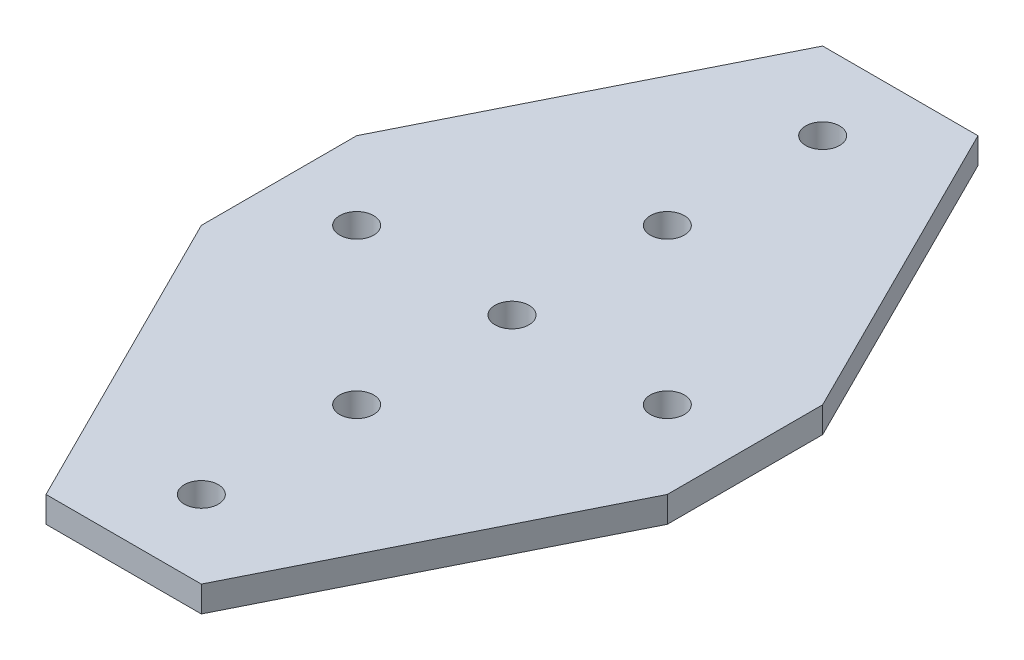
ISO-10303-21;
HEADER;
FILE_DESCRIPTION(('STEP AP214'),'2;1');
FILE_NAME('part.step','',(''),(''),'','','');
FILE_SCHEMA(('AUTOMOTIVE_DESIGN { 1 0 10303 214 1 1 1 1 }'));
ENDSEC;
DATA;
#1=APPLICATION_CONTEXT('core data for automotive mechanical design processes');
#2=APPLICATION_PROTOCOL_DEFINITION('international standard','automotive_design',2000,#1);
#3=PRODUCT_CONTEXT('',#1,'mechanical');
#4=PRODUCT('Part','Part','',(#3));
#5=PRODUCT_RELATED_PRODUCT_CATEGORY('part','',(#4));
#6=PRODUCT_DEFINITION_FORMATION('','',#4);
#7=PRODUCT_DEFINITION_CONTEXT('part definition',#1,'design');
#8=PRODUCT_DEFINITION('design','',#6,#7);
#9=PRODUCT_DEFINITION_SHAPE('','',#8);
#10=(LENGTH_UNIT() NAMED_UNIT(*) SI_UNIT(.MILLI.,.METRE.));
#11=(NAMED_UNIT(*) PLANE_ANGLE_UNIT() SI_UNIT($,.RADIAN.));
#12=(NAMED_UNIT(*) SI_UNIT($,.STERADIAN.) SOLID_ANGLE_UNIT());
#13=UNCERTAINTY_MEASURE_WITH_UNIT(LENGTH_MEASURE(1.E-05),#10,'distance_accuracy_value','');
#14=(GEOMETRIC_REPRESENTATION_CONTEXT(3) GLOBAL_UNCERTAINTY_ASSIGNED_CONTEXT((#13)) GLOBAL_UNIT_ASSIGNED_CONTEXT((#10,
#11,#12)) REPRESENTATION_CONTEXT('',''));
#15=CARTESIAN_POINT('',(0.,0.,0.));
#16=DIRECTION('',(0.,0.,1.));
#17=DIRECTION('',(1.,0.,0.));
#18=AXIS2_PLACEMENT_3D('',#15,#16,#17);
#19=CARTESIAN_POINT('',(0.,6.35,0.));
#20=DIRECTION('',(0.,-1.,0.));
#21=DIRECTION('',(0.,0.,-1.));
#22=AXIS2_PLACEMENT_3D('',#19,#20,#21);
#23=PLANE('',#22);
#24=DIRECTION('',(-0.447213595499958,0.,0.894427190999916));
#25=VECTOR('',#24,1.);
#26=CARTESIAN_POINT('',(-111.200424587781,6.35,-5.71031941031939));
#27=LINE('',#26,#25);
#28=CARTESIAN_POINT('',(-73.1004245877809,6.35,-81.9103194103194));
#29=VERTEX_POINT('',#28);
#30=CARTESIAN_POINT('',(-111.200424587781,6.35,-5.71031941031939));
#31=VERTEX_POINT('',#30);
#32=EDGE_CURVE('E164',#29,#31,#27,.T.);
#33=ORIENTED_EDGE('',*,*,#32,.T.);
#34=DIRECTION('',(0.,0.,1.));
#35=VECTOR('',#34,1.);
#36=CARTESIAN_POINT('',(-111.200424587781,6.35,32.3896805896806));
#37=LINE('',#36,#35);
#38=CARTESIAN_POINT('',(-111.200424587781,6.35,32.3896805896806));
#39=VERTEX_POINT('',#38);
#40=EDGE_CURVE('E100',#31,#39,#37,.T.);
#41=ORIENTED_EDGE('',*,*,#40,.T.);
#42=DIRECTION('',(0.447213595499958,0.,0.894427190999916));
#43=VECTOR('',#42,1.);
#44=CARTESIAN_POINT('',(-73.1004245877809,6.35,108.589680589681));
#45=LINE('',#44,#43);
#46=CARTESIAN_POINT('',(-73.1004245877809,6.35,108.589680589681));
#47=VERTEX_POINT('',#46);
#48=EDGE_CURVE('E185',#39,#47,#45,.T.);
#49=ORIENTED_EDGE('',*,*,#48,.T.);
#50=DIRECTION('',(1.,0.,0.));
#51=VECTOR('',#50,1.);
#52=CARTESIAN_POINT('',(-35.0004245877809,6.35,108.589680589681));
#53=LINE('',#52,#51);
#54=CARTESIAN_POINT('',(-35.0004245877809,6.35,108.589680589681));
#55=VERTEX_POINT('',#54);
#56=EDGE_CURVE('E199',#47,#55,#53,.T.);
#57=ORIENTED_EDGE('',*,*,#56,.T.);
#58=DIRECTION('',(0.447213595499958,0.,-0.894427190999916));
#59=VECTOR('',#58,1.);
#60=CARTESIAN_POINT('',(3.09957541221913,6.35,32.3896805896806));
#61=LINE('',#60,#59);
#62=CARTESIAN_POINT('',(3.09957541221913,6.35,32.3896805896806));
#63=VERTEX_POINT('',#62);
#64=EDGE_CURVE('E119',#55,#63,#61,.T.);
#65=ORIENTED_EDGE('',*,*,#64,.T.);
#66=DIRECTION('',(0.,0.,-1.));
#67=VECTOR('',#66,1.);
#68=CARTESIAN_POINT('',(3.09957541221913,6.35,-5.71031941031939));
#69=LINE('',#68,#67);
#70=CARTESIAN_POINT('',(3.09957541221913,6.35,-5.71031941031939));
#71=VERTEX_POINT('',#70);
#72=EDGE_CURVE('E113',#63,#71,#69,.T.);
#73=ORIENTED_EDGE('',*,*,#72,.T.);
#74=DIRECTION('',(-0.447213595499958,0.,-0.894427190999916));
#75=VECTOR('',#74,1.);
#76=CARTESIAN_POINT('',(-35.0004245877809,6.35,-81.9103194103194));
#77=LINE('',#76,#75);
#78=CARTESIAN_POINT('',(-35.0004245877809,6.35,-81.9103194103194));
#79=VERTEX_POINT('',#78);
#80=EDGE_CURVE('E117',#71,#79,#77,.T.);
#81=ORIENTED_EDGE('',*,*,#80,.T.);
#82=DIRECTION('',(-1.,0.,0.));
#83=VECTOR('',#82,1.);
#84=CARTESIAN_POINT('',(-73.1004245877809,6.35,-81.9103194103194));
#85=LINE('',#84,#83);
#86=EDGE_CURVE('E57',#79,#29,#85,.T.);
#87=ORIENTED_EDGE('',*,*,#86,.T.);
#88=EDGE_LOOP('',(#33,#41,#49,#57,#65,#73,#81,#87));
#89=FACE_BOUND('',#88,.T.);
#90=CARTESIAN_POINT('',(-92.1504245877809,6.35,13.3396805896806));
#91=DIRECTION('',(0.,1.,0.));
#92=DIRECTION('',(0.,0.,1.));
#93=AXIS2_PLACEMENT_3D('',#90,#91,#92);
#94=CIRCLE('',#93,4.1656);
#95=CARTESIAN_POINT('',(-92.1504245877809,6.35,17.5052805896806));
#96=VERTEX_POINT('',#95);
#97=EDGE_CURVE('E146',#96,#96,#94,.T.);
#98=ORIENTED_EDGE('',*,*,#97,.F.);
#99=EDGE_LOOP('',(#98));
#100=FACE_BOUND('',#99,.T.);
#101=CARTESIAN_POINT('',(-54.0504245877809,6.35,13.3396805896806));
#102=DIRECTION('',(0.,1.,0.));
#103=DIRECTION('',(0.,0.,1.));
#104=AXIS2_PLACEMENT_3D('',#101,#102,#103);
#105=CIRCLE('',#104,4.1656);
#106=CARTESIAN_POINT('',(-54.0504245877809,6.35,17.5052805896806));
#107=VERTEX_POINT('',#106);
#108=EDGE_CURVE('E213',#107,#107,#105,.T.);
#109=ORIENTED_EDGE('',*,*,#108,.F.);
#110=EDGE_LOOP('',(#109));
#111=FACE_BOUND('',#110,.T.);
#112=CARTESIAN_POINT('',(-15.9504245877809,6.35,13.3396805896806));
#113=DIRECTION('',(0.,1.,0.));
#114=DIRECTION('',(0.,0.,1.));
#115=AXIS2_PLACEMENT_3D('',#112,#113,#114);
#116=CIRCLE('',#115,4.1656);
#117=CARTESIAN_POINT('',(-15.9504245877809,6.35,17.5052805896806));
#118=VERTEX_POINT('',#117);
#119=EDGE_CURVE('E221',#118,#118,#116,.T.);
#120=ORIENTED_EDGE('',*,*,#119,.F.);
#121=EDGE_LOOP('',(#120));
#122=FACE_BOUND('',#121,.T.);
#123=CARTESIAN_POINT('',(-54.050424587781,6.35,-24.7603194103194));
#124=DIRECTION('',(0.,1.,0.));
#125=DIRECTION('',(0.,0.,1.));
#126=AXIS2_PLACEMENT_3D('',#123,#124,#125);
#127=CIRCLE('',#126,4.1656);
#128=CARTESIAN_POINT('',(-54.050424587781,6.35,-20.5947194103194));
#129=VERTEX_POINT('',#128);
#130=EDGE_CURVE('E229',#129,#129,#127,.T.);
#131=ORIENTED_EDGE('',*,*,#130,.F.);
#132=EDGE_LOOP('',(#131));
#133=FACE_BOUND('',#132,.T.);
#134=CARTESIAN_POINT('',(-54.0504245877811,6.35,-62.8603194103194));
#135=DIRECTION('',(0.,1.,0.));
#136=DIRECTION('',(0.,0.,1.));
#137=AXIS2_PLACEMENT_3D('',#134,#135,#136);
#138=CIRCLE('',#137,4.1656);
#139=CARTESIAN_POINT('',(-54.0504245877811,6.35,-58.6947194103194));
#140=VERTEX_POINT('',#139);
#141=EDGE_CURVE('E237',#140,#140,#138,.T.);
#142=ORIENTED_EDGE('',*,*,#141,.F.);
#143=EDGE_LOOP('',(#142));
#144=FACE_BOUND('',#143,.T.);
#145=CARTESIAN_POINT('',(-54.0504245877805,6.35,51.4396805896806));
#146=DIRECTION('',(0.,1.,0.));
#147=DIRECTION('',(0.,0.,1.));
#148=AXIS2_PLACEMENT_3D('',#145,#146,#147);
#149=CIRCLE('',#148,4.1656);
#150=CARTESIAN_POINT('',(-54.0504245877805,6.35,55.6052805896806));
#151=VERTEX_POINT('',#150);
#152=EDGE_CURVE('E245',#151,#151,#149,.T.);
#153=ORIENTED_EDGE('',*,*,#152,.F.);
#154=EDGE_LOOP('',(#153));
#155=FACE_BOUND('',#154,.T.);
#156=CARTESIAN_POINT('',(-54.0504245877801,6.35,89.5396805896806));
#157=DIRECTION('',(0.,1.,0.));
#158=DIRECTION('',(0.,0.,1.));
#159=AXIS2_PLACEMENT_3D('',#156,#157,#158);
#160=CIRCLE('',#159,4.1656);
#161=CARTESIAN_POINT('',(-54.0504245877801,6.35,93.7052805896806));
#162=VERTEX_POINT('',#161);
#163=EDGE_CURVE('E253',#162,#162,#160,.T.);
#164=ORIENTED_EDGE('',*,*,#163,.F.);
#165=EDGE_LOOP('',(#164));
#166=FACE_BOUND('',#165,.T.);
#167=ADVANCED_FACE('F39',(#89,#100,#111,#122,#133,#144,#155,#166),#23,.F.);
#168=CARTESIAN_POINT('',(0.,0.,0.));
#169=DIRECTION('',(0.,-1.,0.));
#170=DIRECTION('',(0.,0.,-1.));
#171=AXIS2_PLACEMENT_3D('',#168,#169,#170);
#172=PLANE('',#171);
#173=CARTESIAN_POINT('',(-54.0504245877805,0.,51.4396805896806));
#174=DIRECTION('',(0.,1.,0.));
#175=DIRECTION('',(0.,0.,1.));
#176=AXIS2_PLACEMENT_3D('',#173,#174,#175);
#177=CIRCLE('',#176,4.1656);
#178=CARTESIAN_POINT('',(-54.0504245877805,0.,55.6052805896806));
#179=VERTEX_POINT('',#178);
#180=EDGE_CURVE('E249',#179,#179,#177,.T.);
#181=ORIENTED_EDGE('',*,*,#180,.T.);
#182=EDGE_LOOP('',(#181));
#183=FACE_BOUND('',#182,.T.);
#184=CARTESIAN_POINT('',(-54.050424587781,0.,-24.7603194103194));
#185=DIRECTION('',(0.,1.,0.));
#186=DIRECTION('',(0.,0.,1.));
#187=AXIS2_PLACEMENT_3D('',#184,#185,#186);
#188=CIRCLE('',#187,4.1656);
#189=CARTESIAN_POINT('',(-54.050424587781,0.,-20.5947194103194));
#190=VERTEX_POINT('',#189);
#191=EDGE_CURVE('E233',#190,#190,#188,.T.);
#192=ORIENTED_EDGE('',*,*,#191,.T.);
#193=EDGE_LOOP('',(#192));
#194=FACE_BOUND('',#193,.T.);
#195=CARTESIAN_POINT('',(-54.0504245877809,0.,13.3396805896806));
#196=DIRECTION('',(0.,1.,0.));
#197=DIRECTION('',(0.,0.,1.));
#198=AXIS2_PLACEMENT_3D('',#195,#196,#197);
#199=CIRCLE('',#198,4.1656);
#200=CARTESIAN_POINT('',(-54.0504245877809,0.,17.5052805896806));
#201=VERTEX_POINT('',#200);
#202=EDGE_CURVE('E217',#201,#201,#199,.T.);
#203=ORIENTED_EDGE('',*,*,#202,.T.);
#204=EDGE_LOOP('',(#203));
#205=FACE_BOUND('',#204,.T.);
#206=DIRECTION('',(-0.447213595499958,0.,0.894427190999916));
#207=VECTOR('',#206,1.);
#208=CARTESIAN_POINT('',(-111.200424587781,0.,-5.71031941031939));
#209=LINE('',#208,#207);
#210=CARTESIAN_POINT('',(-73.1004245877809,0.,-81.9103194103194));
#211=VERTEX_POINT('',#210);
#212=CARTESIAN_POINT('',(-111.200424587781,0.,-5.71031941031939));
#213=VERTEX_POINT('',#212);
#214=EDGE_CURVE('E141',#211,#213,#209,.T.);
#215=ORIENTED_EDGE('',*,*,#214,.F.);
#216=DIRECTION('',(-1.,0.,0.));
#217=VECTOR('',#216,1.);
#218=CARTESIAN_POINT('',(-73.1004245877809,0.,-81.9103194103194));
#219=LINE('',#218,#217);
#220=CARTESIAN_POINT('',(-35.0004245877809,0.,-81.9103194103194));
#221=VERTEX_POINT('',#220);
#222=EDGE_CURVE('E92',#221,#211,#219,.T.);
#223=ORIENTED_EDGE('',*,*,#222,.F.);
#224=DIRECTION('',(-0.447213595499958,0.,-0.894427190999916));
#225=VECTOR('',#224,1.);
#226=CARTESIAN_POINT('',(-35.0004245877809,0.,-81.9103194103194));
#227=LINE('',#226,#225);
#228=CARTESIAN_POINT('',(3.09957541221913,0.,-5.71031941031939));
#229=VERTEX_POINT('',#228);
#230=EDGE_CURVE('E86',#229,#221,#227,.T.);
#231=ORIENTED_EDGE('',*,*,#230,.F.);
#232=DIRECTION('',(0.,0.,-1.));
#233=VECTOR('',#232,1.);
#234=CARTESIAN_POINT('',(3.09957541221913,0.,-5.71031941031939));
#235=LINE('',#234,#233);
#236=CARTESIAN_POINT('',(3.09957541221913,0.,32.3896805896806));
#237=VERTEX_POINT('',#236);
#238=EDGE_CURVE('E128',#237,#229,#235,.T.);
#239=ORIENTED_EDGE('',*,*,#238,.F.);
#240=DIRECTION('',(0.447213595499958,0.,-0.894427190999916));
#241=VECTOR('',#240,1.);
#242=CARTESIAN_POINT('',(3.09957541221913,0.,32.3896805896806));
#243=LINE('',#242,#241);
#244=CARTESIAN_POINT('',(-35.0004245877809,0.,108.589680589681));
#245=VERTEX_POINT('',#244);
#246=EDGE_CURVE('E155',#245,#237,#243,.T.);
#247=ORIENTED_EDGE('',*,*,#246,.F.);
#248=DIRECTION('',(1.,0.,0.));
#249=VECTOR('',#248,1.);
#250=CARTESIAN_POINT('',(-35.0004245877809,0.,108.589680589681));
#251=LINE('',#250,#249);
#252=CARTESIAN_POINT('',(-73.1004245877809,0.,108.589680589681));
#253=VERTEX_POINT('',#252);
#254=EDGE_CURVE('E152',#253,#245,#251,.T.);
#255=ORIENTED_EDGE('',*,*,#254,.F.);
#256=DIRECTION('',(0.447213595499958,0.,0.894427190999916));
#257=VECTOR('',#256,1.);
#258=CARTESIAN_POINT('',(-73.1004245877809,0.,108.589680589681));
#259=LINE('',#258,#257);
#260=CARTESIAN_POINT('',(-111.200424587781,0.,32.3896805896806));
#261=VERTEX_POINT('',#260);
#262=EDGE_CURVE('E149',#261,#253,#259,.T.);
#263=ORIENTED_EDGE('',*,*,#262,.F.);
#264=DIRECTION('',(0.,0.,1.));
#265=VECTOR('',#264,1.);
#266=CARTESIAN_POINT('',(-111.200424587781,0.,32.3896805896806));
#267=LINE('',#266,#265);
#268=EDGE_CURVE('E145',#213,#261,#267,.T.);
#269=ORIENTED_EDGE('',*,*,#268,.F.);
#270=EDGE_LOOP('',(#215,#223,#231,#239,#247,#255,#263,#269));
#271=FACE_BOUND('',#270,.T.);
#272=CARTESIAN_POINT('',(-92.1504245877809,0.,13.3396805896806));
#273=DIRECTION('',(0.,1.,0.));
#274=DIRECTION('',(0.,0.,1.));
#275=AXIS2_PLACEMENT_3D('',#272,#273,#274);
#276=CIRCLE('',#275,4.1656);
#277=CARTESIAN_POINT('',(-92.1504245877809,0.,17.5052805896806));
#278=VERTEX_POINT('',#277);
#279=EDGE_CURVE('E209',#278,#278,#276,.T.);
#280=ORIENTED_EDGE('',*,*,#279,.T.);
#281=EDGE_LOOP('',(#280));
#282=FACE_BOUND('',#281,.T.);
#283=CARTESIAN_POINT('',(-15.9504245877809,0.,13.3396805896806));
#284=DIRECTION('',(0.,1.,0.));
#285=DIRECTION('',(0.,0.,1.));
#286=AXIS2_PLACEMENT_3D('',#283,#284,#285);
#287=CIRCLE('',#286,4.1656);
#288=CARTESIAN_POINT('',(-15.9504245877809,0.,17.5052805896806));
#289=VERTEX_POINT('',#288);
#290=EDGE_CURVE('E225',#289,#289,#287,.T.);
#291=ORIENTED_EDGE('',*,*,#290,.T.);
#292=EDGE_LOOP('',(#291));
#293=FACE_BOUND('',#292,.T.);
#294=CARTESIAN_POINT('',(-54.0504245877811,0.,-62.8603194103194));
#295=DIRECTION('',(0.,1.,0.));
#296=DIRECTION('',(0.,0.,1.));
#297=AXIS2_PLACEMENT_3D('',#294,#295,#296);
#298=CIRCLE('',#297,4.1656);
#299=CARTESIAN_POINT('',(-54.0504245877811,0.,-58.6947194103194));
#300=VERTEX_POINT('',#299);
#301=EDGE_CURVE('E241',#300,#300,#298,.T.);
#302=ORIENTED_EDGE('',*,*,#301,.T.);
#303=EDGE_LOOP('',(#302));
#304=FACE_BOUND('',#303,.T.);
#305=CARTESIAN_POINT('',(-54.0504245877801,0.,89.5396805896806));
#306=DIRECTION('',(0.,1.,0.));
#307=DIRECTION('',(0.,0.,1.));
#308=AXIS2_PLACEMENT_3D('',#305,#306,#307);
#309=CIRCLE('',#308,4.1656);
#310=CARTESIAN_POINT('',(-54.0504245877801,0.,93.7052805896806));
#311=VERTEX_POINT('',#310);
#312=EDGE_CURVE('E257',#311,#311,#309,.T.);
#313=ORIENTED_EDGE('',*,*,#312,.T.);
#314=EDGE_LOOP('',(#313));
#315=FACE_BOUND('',#314,.T.);
#316=ADVANCED_FACE('F189',(#183,#194,#205,#271,#282,#293,#304,#315),#172,.T.);
#317=CARTESIAN_POINT('',(-111.200424587781,6.35,-5.71031941031939));
#318=DIRECTION('',(0.894427190999916,0.,0.447213595499958));
#319=DIRECTION('',(0.447213595499958,0.,-0.894427190999916));
#320=AXIS2_PLACEMENT_3D('',#317,#318,#319);
#321=PLANE('',#320);
#322=ORIENTED_EDGE('',*,*,#214,.T.);
#323=DIRECTION('',(0.,-1.,0.));
#324=VECTOR('',#323,1.);
#325=CARTESIAN_POINT('',(-111.200424587781,6.35,-5.71031941031939));
#326=LINE('',#325,#324);
#327=EDGE_CURVE('E11',#31,#213,#326,.T.);
#328=ORIENTED_EDGE('',*,*,#327,.F.);
#329=ORIENTED_EDGE('',*,*,#32,.F.);
#330=DIRECTION('',(0.,-1.,0.));
#331=VECTOR('',#330,1.);
#332=CARTESIAN_POINT('',(-73.1004245877809,6.35,-81.9103194103194));
#333=LINE('',#332,#331);
#334=EDGE_CURVE('E137',#29,#211,#333,.T.);
#335=ORIENTED_EDGE('',*,*,#334,.T.);
#336=EDGE_LOOP('',(#322,#328,#329,#335));
#337=FACE_BOUND('',#336,.T.);
#338=ADVANCED_FACE('F41',(#337),#321,.F.);
#339=CARTESIAN_POINT('',(-111.200424587781,6.35,32.3896805896806));
#340=DIRECTION('',(1.,0.,0.));
#341=DIRECTION('',(0.,0.,-1.));
#342=AXIS2_PLACEMENT_3D('',#339,#340,#341);
#343=PLANE('',#342);
#344=ORIENTED_EDGE('',*,*,#268,.T.);
#345=DIRECTION('',(0.,-1.,0.));
#346=VECTOR('',#345,1.);
#347=CARTESIAN_POINT('',(-111.200424587781,6.35,32.3896805896806));
#348=LINE('',#347,#346);
#349=EDGE_CURVE('E49',#39,#261,#348,.T.);
#350=ORIENTED_EDGE('',*,*,#349,.F.);
#351=ORIENTED_EDGE('',*,*,#40,.F.);
#352=ORIENTED_EDGE('',*,*,#327,.T.);
#353=EDGE_LOOP('',(#344,#350,#351,#352));
#354=FACE_BOUND('',#353,.T.);
#355=ADVANCED_FACE('F291',(#354),#343,.F.);
#356=CARTESIAN_POINT('',(-73.1004245877809,6.35,108.589680589681));
#357=DIRECTION('',(0.894427190999916,0.,-0.447213595499958));
#358=DIRECTION('',(-0.447213595499958,0.,-0.894427190999916));
#359=AXIS2_PLACEMENT_3D('',#356,#357,#358);
#360=PLANE('',#359);
#361=ORIENTED_EDGE('',*,*,#262,.T.);
#362=DIRECTION('',(0.,-1.,0.));
#363=VECTOR('',#362,1.);
#364=CARTESIAN_POINT('',(-73.1004245877809,6.35,108.589680589681));
#365=LINE('',#364,#363);
#366=EDGE_CURVE('E175',#47,#253,#365,.T.);
#367=ORIENTED_EDGE('',*,*,#366,.F.);
#368=ORIENTED_EDGE('',*,*,#48,.F.);
#369=ORIENTED_EDGE('',*,*,#349,.T.);
#370=EDGE_LOOP('',(#361,#367,#368,#369));
#371=FACE_BOUND('',#370,.T.);
#372=ADVANCED_FACE('F183',(#371),#360,.F.);
#373=CARTESIAN_POINT('',(-35.0004245877809,6.35,108.589680589681));
#374=DIRECTION('',(0.,0.,-1.));
#375=DIRECTION('',(-1.,0.,0.));
#376=AXIS2_PLACEMENT_3D('',#373,#374,#375);
#377=PLANE('',#376);
#378=ORIENTED_EDGE('',*,*,#254,.T.);
#379=DIRECTION('',(0.,-1.,0.));
#380=VECTOR('',#379,1.);
#381=CARTESIAN_POINT('',(-35.0004245877809,6.35,108.589680589681));
#382=LINE('',#381,#380);
#383=EDGE_CURVE('E171',#55,#245,#382,.T.);
#384=ORIENTED_EDGE('',*,*,#383,.F.);
#385=ORIENTED_EDGE('',*,*,#56,.F.);
#386=ORIENTED_EDGE('',*,*,#366,.T.);
#387=EDGE_LOOP('',(#378,#384,#385,#386));
#388=FACE_BOUND('',#387,.T.);
#389=ADVANCED_FACE('F194',(#388),#377,.F.);
#390=CARTESIAN_POINT('',(3.09957541221913,6.35,32.3896805896806));
#391=DIRECTION('',(-0.894427190999916,0.,-0.447213595499958));
#392=DIRECTION('',(-0.447213595499958,0.,0.894427190999916));
#393=AXIS2_PLACEMENT_3D('',#390,#391,#392);
#394=PLANE('',#393);
#395=ORIENTED_EDGE('',*,*,#246,.T.);
#396=DIRECTION('',(0.,-1.,0.));
#397=VECTOR('',#396,1.);
#398=CARTESIAN_POINT('',(3.09957541221913,6.35,32.3896805896806));
#399=LINE('',#398,#397);
#400=EDGE_CURVE('E130',#63,#237,#399,.T.);
#401=ORIENTED_EDGE('',*,*,#400,.F.);
#402=ORIENTED_EDGE('',*,*,#64,.F.);
#403=ORIENTED_EDGE('',*,*,#383,.T.);
#404=EDGE_LOOP('',(#395,#401,#402,#403));
#405=FACE_BOUND('',#404,.T.);
#406=ADVANCED_FACE('F197',(#405),#394,.F.);
#407=CARTESIAN_POINT('',(3.09957541221913,6.35,-5.71031941031939));
#408=DIRECTION('',(-1.,0.,0.));
#409=DIRECTION('',(0.,0.,1.));
#410=AXIS2_PLACEMENT_3D('',#407,#408,#409);
#411=PLANE('',#410);
#412=ORIENTED_EDGE('',*,*,#238,.T.);
#413=DIRECTION('',(0.,-1.,0.));
#414=VECTOR('',#413,1.);
#415=CARTESIAN_POINT('',(3.09957541221913,6.35,-5.71031941031939));
#416=LINE('',#415,#414);
#417=EDGE_CURVE('E125',#71,#229,#416,.T.);
#418=ORIENTED_EDGE('',*,*,#417,.F.);
#419=ORIENTED_EDGE('',*,*,#72,.F.);
#420=ORIENTED_EDGE('',*,*,#400,.T.);
#421=EDGE_LOOP('',(#412,#418,#419,#420));
#422=FACE_BOUND('',#421,.T.);
#423=ADVANCED_FACE('F126',(#422),#411,.F.);
#424=CARTESIAN_POINT('',(-35.0004245877809,6.35,-81.9103194103194));
#425=DIRECTION('',(-0.894427190999916,0.,0.447213595499958));
#426=DIRECTION('',(0.447213595499958,0.,0.894427190999916));
#427=AXIS2_PLACEMENT_3D('',#424,#425,#426);
#428=PLANE('',#427);
#429=ORIENTED_EDGE('',*,*,#230,.T.);
#430=DIRECTION('',(0.,-1.,0.));
#431=VECTOR('',#430,1.);
#432=CARTESIAN_POINT('',(-35.0004245877809,6.35,-81.9103194103194));
#433=LINE('',#432,#431);
#434=EDGE_CURVE('E131',#79,#221,#433,.T.);
#435=ORIENTED_EDGE('',*,*,#434,.F.);
#436=ORIENTED_EDGE('',*,*,#80,.F.);
#437=ORIENTED_EDGE('',*,*,#417,.T.);
#438=EDGE_LOOP('',(#429,#435,#436,#437));
#439=FACE_BOUND('',#438,.T.);
#440=ADVANCED_FACE('F133',(#439),#428,.F.);
#441=CARTESIAN_POINT('',(-73.1004245877809,6.35,-81.9103194103194));
#442=DIRECTION('',(0.,0.,1.));
#443=DIRECTION('',(1.,0.,0.));
#444=AXIS2_PLACEMENT_3D('',#441,#442,#443);
#445=PLANE('',#444);
#446=ORIENTED_EDGE('',*,*,#222,.T.);
#447=ORIENTED_EDGE('',*,*,#334,.F.);
#448=ORIENTED_EDGE('',*,*,#86,.F.);
#449=ORIENTED_EDGE('',*,*,#434,.T.);
#450=EDGE_LOOP('',(#446,#447,#448,#449));
#451=FACE_BOUND('',#450,.T.);
#452=ADVANCED_FACE('F279',(#451),#445,.F.);
#453=CARTESIAN_POINT('',(-92.1504245877809,6.35,13.3396805896806));
#454=DIRECTION('',(0.,-1.,0.));
#455=DIRECTION('',(0.,0.,-1.));
#456=AXIS2_PLACEMENT_3D('',#453,#454,#455);
#457=CYLINDRICAL_SURFACE('',#456,4.1656);
#458=ORIENTED_EDGE('',*,*,#97,.T.);
#459=EDGE_LOOP('',(#458));
#460=FACE_BOUND('',#459,.T.);
#461=ORIENTED_EDGE('',*,*,#279,.F.);
#462=EDGE_LOOP('',(#461));
#463=FACE_BOUND('',#462,.T.);
#464=ADVANCED_FACE('F276',(#460,#463),#457,.F.);
#465=CARTESIAN_POINT('',(-54.0504245877809,6.35,13.3396805896806));
#466=DIRECTION('',(0.,-1.,0.));
#467=DIRECTION('',(0.,0.,-1.));
#468=AXIS2_PLACEMENT_3D('',#465,#466,#467);
#469=CYLINDRICAL_SURFACE('',#468,4.1656);
#470=ORIENTED_EDGE('',*,*,#108,.T.);
#471=EDGE_LOOP('',(#470));
#472=FACE_BOUND('',#471,.T.);
#473=ORIENTED_EDGE('',*,*,#202,.F.);
#474=EDGE_LOOP('',(#473));
#475=FACE_BOUND('',#474,.T.);
#476=ADVANCED_FACE('F355',(#472,#475),#469,.F.);
#477=CARTESIAN_POINT('',(-15.9504245877809,6.35,13.3396805896806));
#478=DIRECTION('',(0.,-1.,0.));
#479=DIRECTION('',(0.,0.,-1.));
#480=AXIS2_PLACEMENT_3D('',#477,#478,#479);
#481=CYLINDRICAL_SURFACE('',#480,4.1656);
#482=ORIENTED_EDGE('',*,*,#119,.T.);
#483=EDGE_LOOP('',(#482));
#484=FACE_BOUND('',#483,.T.);
#485=ORIENTED_EDGE('',*,*,#290,.F.);
#486=EDGE_LOOP('',(#485));
#487=FACE_BOUND('',#486,.T.);
#488=ADVANCED_FACE('F363',(#484,#487),#481,.F.);
#489=CARTESIAN_POINT('',(-54.050424587781,6.35,-24.7603194103194));
#490=DIRECTION('',(0.,-1.,0.));
#491=DIRECTION('',(0.,0.,-1.));
#492=AXIS2_PLACEMENT_3D('',#489,#490,#491);
#493=CYLINDRICAL_SURFACE('',#492,4.1656);
#494=ORIENTED_EDGE('',*,*,#130,.T.);
#495=EDGE_LOOP('',(#494));
#496=FACE_BOUND('',#495,.T.);
#497=ORIENTED_EDGE('',*,*,#191,.F.);
#498=EDGE_LOOP('',(#497));
#499=FACE_BOUND('',#498,.T.);
#500=ADVANCED_FACE('F371',(#496,#499),#493,.F.);
#501=CARTESIAN_POINT('',(-54.0504245877811,6.35,-62.8603194103194));
#502=DIRECTION('',(0.,-1.,0.));
#503=DIRECTION('',(0.,0.,-1.));
#504=AXIS2_PLACEMENT_3D('',#501,#502,#503);
#505=CYLINDRICAL_SURFACE('',#504,4.1656);
#506=ORIENTED_EDGE('',*,*,#141,.T.);
#507=EDGE_LOOP('',(#506));
#508=FACE_BOUND('',#507,.T.);
#509=ORIENTED_EDGE('',*,*,#301,.F.);
#510=EDGE_LOOP('',(#509));
#511=FACE_BOUND('',#510,.T.);
#512=ADVANCED_FACE('F380',(#508,#511),#505,.F.);
#513=CARTESIAN_POINT('',(-54.0504245877805,6.35,51.4396805896806));
#514=DIRECTION('',(0.,-1.,0.));
#515=DIRECTION('',(0.,0.,-1.));
#516=AXIS2_PLACEMENT_3D('',#513,#514,#515);
#517=CYLINDRICAL_SURFACE('',#516,4.1656);
#518=ORIENTED_EDGE('',*,*,#152,.T.);
#519=EDGE_LOOP('',(#518));
#520=FACE_BOUND('',#519,.T.);
#521=ORIENTED_EDGE('',*,*,#180,.F.);
#522=EDGE_LOOP('',(#521));
#523=FACE_BOUND('',#522,.T.);
#524=ADVANCED_FACE('F389',(#520,#523),#517,.F.);
#525=CARTESIAN_POINT('',(-54.0504245877801,6.35,89.5396805896806));
#526=DIRECTION('',(0.,-1.,0.));
#527=DIRECTION('',(0.,0.,-1.));
#528=AXIS2_PLACEMENT_3D('',#525,#526,#527);
#529=CYLINDRICAL_SURFACE('',#528,4.1656);
#530=ORIENTED_EDGE('',*,*,#163,.T.);
#531=EDGE_LOOP('',(#530));
#532=FACE_BOUND('',#531,.T.);
#533=ORIENTED_EDGE('',*,*,#312,.F.);
#534=EDGE_LOOP('',(#533));
#535=FACE_BOUND('',#534,.T.);
#536=ADVANCED_FACE('F265',(#532,#535),#529,.F.);
#537=CLOSED_SHELL('',(#167,#316,#338,#355,#372,#389,#406,#423,#440,#452,#464,#476,#488,#500,
#512,#524,#536));
#538=MANIFOLD_SOLID_BREP('B2',#537);
#539=ADVANCED_BREP_SHAPE_REPRESENTATION('',(#18,#538),#14);
#540=SHAPE_DEFINITION_REPRESENTATION(#9,#539);
ENDSEC;
END-ISO-10303-21;
